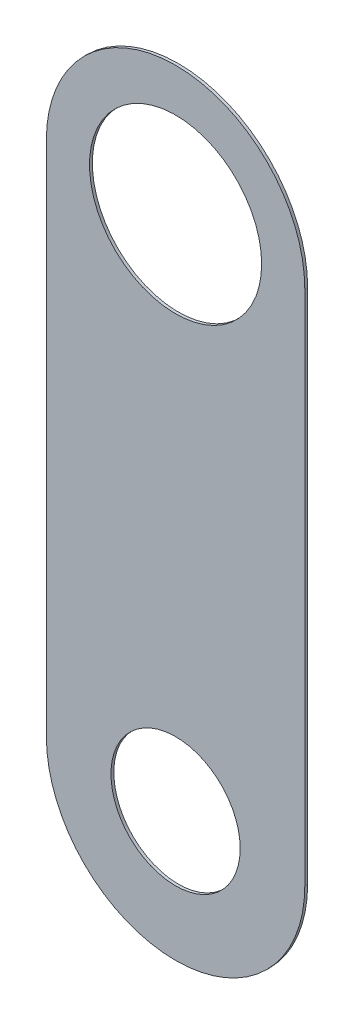
ISO-10303-21;
HEADER;
FILE_DESCRIPTION(('STEP AP214'),'2;1');
FILE_NAME('part.step','',(''),(''),'','','');
FILE_SCHEMA(('AUTOMOTIVE_DESIGN { 1 0 10303 214 1 1 1 1 }'));
ENDSEC;
DATA;
#1=APPLICATION_CONTEXT('core data for automotive mechanical design processes');
#2=APPLICATION_PROTOCOL_DEFINITION('international standard','automotive_design',2000,#1);
#3=PRODUCT_CONTEXT('',#1,'mechanical');
#4=PRODUCT('Part','Part','',(#3));
#5=PRODUCT_RELATED_PRODUCT_CATEGORY('part','',(#4));
#6=PRODUCT_DEFINITION_FORMATION('','',#4);
#7=PRODUCT_DEFINITION_CONTEXT('part definition',#1,'design');
#8=PRODUCT_DEFINITION('design','',#6,#7);
#9=PRODUCT_DEFINITION_SHAPE('','',#8);
#10=(LENGTH_UNIT() NAMED_UNIT(*) SI_UNIT(.MILLI.,.METRE.));
#11=(NAMED_UNIT(*) PLANE_ANGLE_UNIT() SI_UNIT($,.RADIAN.));
#12=(NAMED_UNIT(*) SI_UNIT($,.STERADIAN.) SOLID_ANGLE_UNIT());
#13=UNCERTAINTY_MEASURE_WITH_UNIT(LENGTH_MEASURE(1.E-05),#10,'distance_accuracy_value','');
#14=(GEOMETRIC_REPRESENTATION_CONTEXT(3) GLOBAL_UNCERTAINTY_ASSIGNED_CONTEXT((#13)) GLOBAL_UNIT_ASSIGNED_CONTEXT((#10,
#11,#12)) REPRESENTATION_CONTEXT('',''));
#15=CARTESIAN_POINT('',(0.,0.,0.));
#16=DIRECTION('',(0.,0.,1.));
#17=DIRECTION('',(1.,0.,0.));
#18=AXIS2_PLACEMENT_3D('',#15,#16,#17);
#19=CARTESIAN_POINT('',(25.4,0.,0.5588));
#20=DIRECTION('',(0.,0.,-1.));
#21=DIRECTION('',(-1.,0.,0.));
#22=AXIS2_PLACEMENT_3D('',#19,#20,#21);
#23=CYLINDRICAL_SURFACE('',#22,25.4);
#24=CARTESIAN_POINT('',(25.4,0.,0.));
#25=DIRECTION('',(0.,0.,1.));
#26=DIRECTION('',(-1.,0.,0.));
#27=AXIS2_PLACEMENT_3D('',#24,#25,#26);
#28=CIRCLE('',#27,25.4);
#29=CARTESIAN_POINT('',(0.,0.,0.));
#30=VERTEX_POINT('',#29);
#31=CARTESIAN_POINT('',(50.8,0.,0.));
#32=VERTEX_POINT('',#31);
#33=EDGE_CURVE('E134',#30,#32,#28,.T.);
#34=ORIENTED_EDGE('',*,*,#33,.T.);
#35=DIRECTION('',(0.,0.,-1.));
#36=VECTOR('',#35,1.);
#37=CARTESIAN_POINT('',(50.8,0.,0.5588));
#38=LINE('',#37,#36);
#39=CARTESIAN_POINT('',(50.8,0.,0.5588));
#40=VERTEX_POINT('',#39);
#41=EDGE_CURVE('E12',#40,#32,#38,.T.);
#42=ORIENTED_EDGE('',*,*,#41,.F.);
#43=CARTESIAN_POINT('',(25.4,0.,0.5588));
#44=DIRECTION('',(0.,0.,1.));
#45=DIRECTION('',(-1.,0.,0.));
#46=AXIS2_PLACEMENT_3D('',#43,#44,#45);
#47=CIRCLE('',#46,25.4);
#48=CARTESIAN_POINT('',(0.,0.,0.5588));
#49=VERTEX_POINT('',#48);
#50=EDGE_CURVE('E113',#49,#40,#47,.T.);
#51=ORIENTED_EDGE('',*,*,#50,.F.);
#52=DIRECTION('',(0.,0.,-1.));
#53=VECTOR('',#52,1.);
#54=CARTESIAN_POINT('',(0.,0.,0.5588));
#55=LINE('',#54,#53);
#56=EDGE_CURVE('E126',#49,#30,#55,.T.);
#57=ORIENTED_EDGE('',*,*,#56,.T.);
#58=EDGE_LOOP('',(#34,#42,#51,#57));
#59=FACE_BOUND('',#58,.T.);
#60=ADVANCED_FACE('F62',(#59),#23,.T.);
#61=CARTESIAN_POINT('',(50.8,101.6,0.5588));
#62=DIRECTION('',(-1.,0.,0.));
#63=DIRECTION('',(0.,-1.,0.));
#64=AXIS2_PLACEMENT_3D('',#61,#62,#63);
#65=PLANE('',#64);
#66=DIRECTION('',(0.,1.,0.));
#67=VECTOR('',#66,1.);
#68=CARTESIAN_POINT('',(50.8,101.6,0.));
#69=LINE('',#68,#67);
#70=CARTESIAN_POINT('',(50.8,101.6,0.));
#71=VERTEX_POINT('',#70);
#72=EDGE_CURVE('E116',#32,#71,#69,.T.);
#73=ORIENTED_EDGE('',*,*,#72,.T.);
#74=DIRECTION('',(0.,0.,-1.));
#75=VECTOR('',#74,1.);
#76=CARTESIAN_POINT('',(50.8,101.6,0.5588));
#77=LINE('',#76,#75);
#78=CARTESIAN_POINT('',(50.8,101.6,0.5588));
#79=VERTEX_POINT('',#78);
#80=EDGE_CURVE('E75',#79,#71,#77,.T.);
#81=ORIENTED_EDGE('',*,*,#80,.F.);
#82=DIRECTION('',(0.,1.,0.));
#83=VECTOR('',#82,1.);
#84=CARTESIAN_POINT('',(50.8,101.6,0.5588));
#85=LINE('',#84,#83);
#86=EDGE_CURVE('E109',#40,#79,#85,.T.);
#87=ORIENTED_EDGE('',*,*,#86,.F.);
#88=ORIENTED_EDGE('',*,*,#41,.T.);
#89=EDGE_LOOP('',(#73,#81,#87,#88));
#90=FACE_BOUND('',#89,.T.);
#91=ADVANCED_FACE('F120',(#90),#65,.F.);
#92=CARTESIAN_POINT('',(25.4,101.6,0.5588));
#93=DIRECTION('',(0.,0.,-1.));
#94=DIRECTION('',(-1.,0.,0.));
#95=AXIS2_PLACEMENT_3D('',#92,#93,#94);
#96=CYLINDRICAL_SURFACE('',#95,25.4);
#97=CARTESIAN_POINT('',(25.4,101.6,0.));
#98=DIRECTION('',(0.,0.,1.));
#99=DIRECTION('',(1.,0.,0.));
#100=AXIS2_PLACEMENT_3D('',#97,#98,#99);
#101=CIRCLE('',#100,25.4);
#102=CARTESIAN_POINT('',(0.,101.6,0.));
#103=VERTEX_POINT('',#102);
#104=EDGE_CURVE('E100',#71,#103,#101,.T.);
#105=ORIENTED_EDGE('',*,*,#104,.T.);
#106=DIRECTION('',(0.,0.,-1.));
#107=VECTOR('',#106,1.);
#108=CARTESIAN_POINT('',(0.,101.6,0.5588));
#109=LINE('',#108,#107);
#110=CARTESIAN_POINT('',(0.,101.6,0.5588));
#111=VERTEX_POINT('',#110);
#112=EDGE_CURVE('E125',#111,#103,#109,.T.);
#113=ORIENTED_EDGE('',*,*,#112,.F.);
#114=CARTESIAN_POINT('',(25.4,101.6,0.5588));
#115=DIRECTION('',(0.,0.,1.));
#116=DIRECTION('',(1.,0.,0.));
#117=AXIS2_PLACEMENT_3D('',#114,#115,#116);
#118=CIRCLE('',#117,25.4);
#119=EDGE_CURVE('E114',#79,#111,#118,.T.);
#120=ORIENTED_EDGE('',*,*,#119,.F.);
#121=ORIENTED_EDGE('',*,*,#80,.T.);
#122=EDGE_LOOP('',(#105,#113,#120,#121));
#123=FACE_BOUND('',#122,.T.);
#124=ADVANCED_FACE('F122',(#123),#96,.T.);
#125=CARTESIAN_POINT('',(0.,0.,0.5588));
#126=DIRECTION('',(1.,0.,0.));
#127=DIRECTION('',(0.,0.,-1.));
#128=AXIS2_PLACEMENT_3D('',#125,#126,#127);
#129=PLANE('',#128);
#130=DIRECTION('',(0.,-1.,0.));
#131=VECTOR('',#130,1.);
#132=CARTESIAN_POINT('',(0.,0.,0.));
#133=LINE('',#132,#131);
#134=EDGE_CURVE('E103',#103,#30,#133,.T.);
#135=ORIENTED_EDGE('',*,*,#134,.T.);
#136=ORIENTED_EDGE('',*,*,#56,.F.);
#137=DIRECTION('',(0.,-1.,0.));
#138=VECTOR('',#137,1.);
#139=CARTESIAN_POINT('',(0.,0.,0.5588));
#140=LINE('',#139,#138);
#141=EDGE_CURVE('E76',#111,#49,#140,.T.);
#142=ORIENTED_EDGE('',*,*,#141,.F.);
#143=ORIENTED_EDGE('',*,*,#112,.T.);
#144=EDGE_LOOP('',(#135,#136,#142,#143));
#145=FACE_BOUND('',#144,.T.);
#146=ADVANCED_FACE('F150',(#145),#129,.F.);
#147=CARTESIAN_POINT('',(25.4,0.,0.5588));
#148=DIRECTION('',(0.,0.,-1.));
#149=DIRECTION('',(-1.,0.,0.));
#150=AXIS2_PLACEMENT_3D('',#147,#148,#149);
#151=PLANE('',#150);
#152=CARTESIAN_POINT('',(25.4,101.6,0.5588));
#153=DIRECTION('',(0.,0.,1.));
#154=DIRECTION('',(1.,0.,0.));
#155=AXIS2_PLACEMENT_3D('',#152,#153,#154);
#156=CIRCLE('',#155,16.9164);
#157=CARTESIAN_POINT('',(42.3164,101.6,0.5588));
#158=VERTEX_POINT('',#157);
#159=EDGE_CURVE('E162',#158,#158,#156,.T.);
#160=ORIENTED_EDGE('',*,*,#159,.F.);
#161=EDGE_LOOP('',(#160));
#162=FACE_BOUND('',#161,.T.);
#163=CARTESIAN_POINT('',(25.4,0.,0.5588));
#164=DIRECTION('',(0.,0.,1.));
#165=DIRECTION('',(1.,0.,0.));
#166=AXIS2_PLACEMENT_3D('',#163,#164,#165);
#167=CIRCLE('',#166,12.7);
#168=CARTESIAN_POINT('',(38.1,0.,0.5588));
#169=VERTEX_POINT('',#168);
#170=EDGE_CURVE('E157',#169,#169,#167,.T.);
#171=ORIENTED_EDGE('',*,*,#170,.F.);
#172=EDGE_LOOP('',(#171));
#173=FACE_BOUND('',#172,.T.);
#174=ORIENTED_EDGE('',*,*,#50,.T.);
#175=ORIENTED_EDGE('',*,*,#86,.T.);
#176=ORIENTED_EDGE('',*,*,#119,.T.);
#177=ORIENTED_EDGE('',*,*,#141,.T.);
#178=EDGE_LOOP('',(#174,#175,#176,#177));
#179=FACE_BOUND('',#178,.T.);
#180=ADVANCED_FACE('F112',(#162,#173,#179),#151,.F.);
#181=CARTESIAN_POINT('',(25.4,0.,0.));
#182=DIRECTION('',(0.,0.,-1.));
#183=DIRECTION('',(-1.,0.,0.));
#184=AXIS2_PLACEMENT_3D('',#181,#182,#183);
#185=PLANE('',#184);
#186=CARTESIAN_POINT('',(25.4,101.6,0.));
#187=DIRECTION('',(0.,0.,1.));
#188=DIRECTION('',(1.,0.,0.));
#189=AXIS2_PLACEMENT_3D('',#186,#187,#188);
#190=CIRCLE('',#189,16.9164);
#191=CARTESIAN_POINT('',(42.3164,101.6,0.));
#192=VERTEX_POINT('',#191);
#193=EDGE_CURVE('E136',#192,#192,#190,.T.);
#194=ORIENTED_EDGE('',*,*,#193,.T.);
#195=EDGE_LOOP('',(#194));
#196=FACE_BOUND('',#195,.T.);
#197=CARTESIAN_POINT('',(25.4,0.,0.));
#198=DIRECTION('',(0.,0.,1.));
#199=DIRECTION('',(1.,0.,0.));
#200=AXIS2_PLACEMENT_3D('',#197,#198,#199);
#201=CIRCLE('',#200,12.7);
#202=CARTESIAN_POINT('',(38.1,0.,0.));
#203=VERTEX_POINT('',#202);
#204=EDGE_CURVE('E154',#203,#203,#201,.T.);
#205=ORIENTED_EDGE('',*,*,#204,.T.);
#206=EDGE_LOOP('',(#205));
#207=FACE_BOUND('',#206,.T.);
#208=ORIENTED_EDGE('',*,*,#33,.F.);
#209=ORIENTED_EDGE('',*,*,#134,.F.);
#210=ORIENTED_EDGE('',*,*,#104,.F.);
#211=ORIENTED_EDGE('',*,*,#72,.F.);
#212=EDGE_LOOP('',(#208,#209,#210,#211));
#213=FACE_BOUND('',#212,.T.);
#214=ADVANCED_FACE('F147',(#196,#207,#213),#185,.T.);
#215=CARTESIAN_POINT('',(25.4,0.,0.));
#216=DIRECTION('',(0.,0.,1.));
#217=DIRECTION('',(1.,0.,0.));
#218=AXIS2_PLACEMENT_3D('',#215,#216,#217);
#219=CYLINDRICAL_SURFACE('',#218,12.7);
#220=ORIENTED_EDGE('',*,*,#204,.F.);
#221=EDGE_LOOP('',(#220));
#222=FACE_BOUND('',#221,.T.);
#223=ORIENTED_EDGE('',*,*,#170,.T.);
#224=EDGE_LOOP('',(#223));
#225=FACE_BOUND('',#224,.T.);
#226=ADVANCED_FACE('F180',(#222,#225),#219,.F.);
#227=CARTESIAN_POINT('',(25.4,101.6,0.));
#228=DIRECTION('',(0.,0.,1.));
#229=DIRECTION('',(1.,0.,0.));
#230=AXIS2_PLACEMENT_3D('',#227,#228,#229);
#231=CYLINDRICAL_SURFACE('',#230,16.9164);
#232=ORIENTED_EDGE('',*,*,#193,.F.);
#233=EDGE_LOOP('',(#232));
#234=FACE_BOUND('',#233,.T.);
#235=ORIENTED_EDGE('',*,*,#159,.T.);
#236=EDGE_LOOP('',(#235));
#237=FACE_BOUND('',#236,.T.);
#238=ADVANCED_FACE('F175',(#234,#237),#231,.F.);
#239=CLOSED_SHELL('',(#60,#91,#124,#146,#180,#214,#226,#238));
#240=MANIFOLD_SOLID_BREP('B2',#239);
#241=ADVANCED_BREP_SHAPE_REPRESENTATION('',(#18,#240),#14);
#242=SHAPE_DEFINITION_REPRESENTATION(#9,#241);
ENDSEC;
END-ISO-10303-21;
